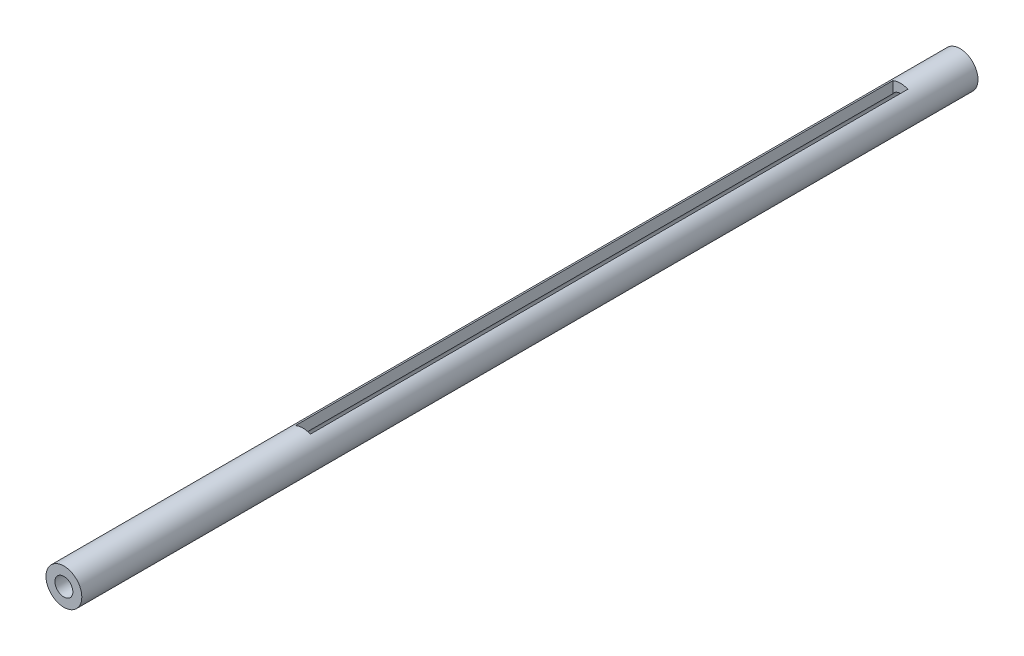
ISO-10303-21;
HEADER;
FILE_DESCRIPTION(('STEP AP214'),'2;1');
FILE_NAME('part.step','',(''),(''),'','','');
FILE_SCHEMA(('AUTOMOTIVE_DESIGN { 1 0 10303 214 1 1 1 1 }'));
ENDSEC;
DATA;
#1=APPLICATION_CONTEXT('core data for automotive mechanical design processes');
#2=APPLICATION_PROTOCOL_DEFINITION('international standard','automotive_design',2000,#1);
#3=PRODUCT_CONTEXT('',#1,'mechanical');
#4=PRODUCT('Part','Part','',(#3));
#5=PRODUCT_RELATED_PRODUCT_CATEGORY('part','',(#4));
#6=PRODUCT_DEFINITION_FORMATION('','',#4);
#7=PRODUCT_DEFINITION_CONTEXT('part definition',#1,'design');
#8=PRODUCT_DEFINITION('design','',#6,#7);
#9=PRODUCT_DEFINITION_SHAPE('','',#8);
#10=(LENGTH_UNIT() NAMED_UNIT(*) SI_UNIT(.MILLI.,.METRE.));
#11=(NAMED_UNIT(*) PLANE_ANGLE_UNIT() SI_UNIT($,.RADIAN.));
#12=(NAMED_UNIT(*) SI_UNIT($,.STERADIAN.) SOLID_ANGLE_UNIT());
#13=UNCERTAINTY_MEASURE_WITH_UNIT(LENGTH_MEASURE(1.E-05),#10,'distance_accuracy_value','');
#14=(GEOMETRIC_REPRESENTATION_CONTEXT(3) GLOBAL_UNCERTAINTY_ASSIGNED_CONTEXT((#13)) GLOBAL_UNIT_ASSIGNED_CONTEXT((#10,
#11,#12)) REPRESENTATION_CONTEXT('',''));
#15=CARTESIAN_POINT('',(0.,0.,0.));
#16=DIRECTION('',(0.,0.,1.));
#17=DIRECTION('',(1.,0.,0.));
#18=AXIS2_PLACEMENT_3D('',#15,#16,#17);
#19=CARTESIAN_POINT('',(0.,0.,150.));
#20=DIRECTION('',(0.,0.,1.));
#21=DIRECTION('',(1.,0.,0.));
#22=AXIS2_PLACEMENT_3D('',#19,#20,#21);
#23=PLANE('',#22);
#24=CARTESIAN_POINT('',(0.,0.,150.));
#25=DIRECTION('',(0.,0.,1.));
#26=DIRECTION('',(1.,0.,0.));
#27=AXIS2_PLACEMENT_3D('',#24,#25,#26);
#28=CIRCLE('',#27,3.);
#29=CARTESIAN_POINT('',(3.,0.,150.));
#30=VERTEX_POINT('',#29);
#31=EDGE_CURVE('E113',#30,#30,#28,.T.);
#32=ORIENTED_EDGE('',*,*,#31,.T.);
#33=EDGE_LOOP('',(#32));
#34=FACE_BOUND('',#33,.T.);
#35=CARTESIAN_POINT('',(0.,0.,150.));
#36=DIRECTION('',(0.,0.,1.));
#37=DIRECTION('',(1.,0.,0.));
#38=AXIS2_PLACEMENT_3D('',#35,#36,#37);
#39=CIRCLE('',#38,1.5);
#40=CARTESIAN_POINT('',(1.5,0.,150.));
#41=VERTEX_POINT('',#40);
#42=EDGE_CURVE('E104',#41,#41,#39,.T.);
#43=ORIENTED_EDGE('',*,*,#42,.F.);
#44=EDGE_LOOP('',(#43));
#45=FACE_BOUND('',#44,.T.);
#46=ADVANCED_FACE('F39',(#34,#45),#23,.T.);
#47=CARTESIAN_POINT('',(0.,0.,0.));
#48=DIRECTION('',(0.,0.,1.));
#49=DIRECTION('',(1.,0.,0.));
#50=AXIS2_PLACEMENT_3D('',#47,#48,#49);
#51=PLANE('',#50);
#52=CARTESIAN_POINT('',(0.,0.,0.));
#53=DIRECTION('',(0.,0.,1.));
#54=DIRECTION('',(1.,0.,0.));
#55=AXIS2_PLACEMENT_3D('',#52,#53,#54);
#56=CIRCLE('',#55,3.);
#57=CARTESIAN_POINT('',(3.,0.,0.));
#58=VERTEX_POINT('',#57);
#59=EDGE_CURVE('E111',#58,#58,#56,.T.);
#60=ORIENTED_EDGE('',*,*,#59,.F.);
#61=EDGE_LOOP('',(#60));
#62=FACE_BOUND('',#61,.T.);
#63=CARTESIAN_POINT('',(0.,0.,0.));
#64=DIRECTION('',(0.,0.,1.));
#65=DIRECTION('',(1.,0.,0.));
#66=AXIS2_PLACEMENT_3D('',#63,#64,#65);
#67=CIRCLE('',#66,1.5);
#68=CARTESIAN_POINT('',(1.5,0.,0.));
#69=VERTEX_POINT('',#68);
#70=EDGE_CURVE('E99',#69,#69,#67,.T.);
#71=ORIENTED_EDGE('',*,*,#70,.T.);
#72=EDGE_LOOP('',(#71));
#73=FACE_BOUND('',#72,.T.);
#74=ADVANCED_FACE('F154',(#62,#73),#51,.F.);
#75=CARTESIAN_POINT('',(0.,0.,150.));
#76=DIRECTION('',(0.,0.,-1.));
#77=DIRECTION('',(-1.,0.,0.));
#78=AXIS2_PLACEMENT_3D('',#75,#76,#77);
#79=CYLINDRICAL_SURFACE('',#78,3.);
#80=DIRECTION('',(0.,0.,-1.));
#81=VECTOR('',#80,1.);
#82=CARTESIAN_POINT('',(-1.25,2.72717802865893,150.));
#83=LINE('',#82,#81);
#84=CARTESIAN_POINT('',(-1.25,2.72717802865893,9.99999999999999));
#85=VERTEX_POINT('',#84);
#86=CARTESIAN_POINT('',(-1.25,2.72717802865893,110.));
#87=VERTEX_POINT('',#86);
#88=EDGE_CURVE('E97',#85,#87,#83,.F.);
#89=ORIENTED_EDGE('',*,*,#88,.F.);
#90=CARTESIAN_POINT('',(0.,0.,9.99999999999998));
#91=DIRECTION('',(0.,0.,-1.));
#92=DIRECTION('',(-1.,0.,0.));
#93=AXIS2_PLACEMENT_3D('',#90,#91,#92);
#94=CIRCLE('',#93,3.);
#95=CARTESIAN_POINT('',(1.25,2.72717802865893,9.99999999999999));
#96=VERTEX_POINT('',#95);
#97=EDGE_CURVE('E89',#85,#96,#94,.T.);
#98=ORIENTED_EDGE('',*,*,#97,.T.);
#99=DIRECTION('',(0.,0.,-1.));
#100=VECTOR('',#99,1.);
#101=CARTESIAN_POINT('',(1.25,2.72717802865893,150.));
#102=LINE('',#101,#100);
#103=CARTESIAN_POINT('',(1.25,2.72717802865893,110.));
#104=VERTEX_POINT('',#103);
#105=EDGE_CURVE('E77',#96,#104,#102,.F.);
#106=ORIENTED_EDGE('',*,*,#105,.T.);
#107=CARTESIAN_POINT('',(0.,0.,110.));
#108=DIRECTION('',(0.,0.,-1.));
#109=DIRECTION('',(-1.,0.,0.));
#110=AXIS2_PLACEMENT_3D('',#107,#108,#109);
#111=CIRCLE('',#110,3.);
#112=EDGE_CURVE('E83',#87,#104,#111,.T.);
#113=ORIENTED_EDGE('',*,*,#112,.F.);
#114=EDGE_LOOP('',(#89,#98,#106,#113));
#115=FACE_BOUND('',#114,.T.);
#116=ORIENTED_EDGE('',*,*,#31,.F.);
#117=EDGE_LOOP('',(#116));
#118=FACE_BOUND('',#117,.T.);
#119=ORIENTED_EDGE('',*,*,#59,.T.);
#120=EDGE_LOOP('',(#119));
#121=FACE_BOUND('',#120,.T.);
#122=ADVANCED_FACE('F41',(#115,#118,#121),#79,.T.);
#123=CARTESIAN_POINT('',(0.,0.,150.));
#124=DIRECTION('',(0.,0.,-1.));
#125=DIRECTION('',(-1.,0.,0.));
#126=AXIS2_PLACEMENT_3D('',#123,#124,#125);
#127=CYLINDRICAL_SURFACE('',#126,1.5);
#128=CARTESIAN_POINT('',(0.,0.,9.99999999999998));
#129=DIRECTION('',(0.,0.,-1.));
#130=DIRECTION('',(-1.,0.,0.));
#131=AXIS2_PLACEMENT_3D('',#128,#129,#130);
#132=CIRCLE('',#131,1.5);
#133=CARTESIAN_POINT('',(-1.25,0.829156197588846,9.99999999999999));
#134=VERTEX_POINT('',#133);
#135=CARTESIAN_POINT('',(1.25,0.82915619758885,10.));
#136=VERTEX_POINT('',#135);
#137=EDGE_CURVE('E11',#134,#136,#132,.T.);
#138=ORIENTED_EDGE('',*,*,#137,.F.);
#139=DIRECTION('',(0.,0.,-1.));
#140=VECTOR('',#139,1.);
#141=CARTESIAN_POINT('',(-1.25,0.82915619758885,150.));
#142=LINE('',#141,#140);
#143=CARTESIAN_POINT('',(-1.25,0.82915619758885,110.));
#144=VERTEX_POINT('',#143);
#145=EDGE_CURVE('E48',#134,#144,#142,.F.);
#146=ORIENTED_EDGE('',*,*,#145,.T.);
#147=CARTESIAN_POINT('',(0.,0.,110.));
#148=DIRECTION('',(0.,0.,-1.));
#149=DIRECTION('',(-1.,0.,0.));
#150=AXIS2_PLACEMENT_3D('',#147,#148,#149);
#151=CIRCLE('',#150,1.5);
#152=CARTESIAN_POINT('',(1.25,0.829156197588846,110.));
#153=VERTEX_POINT('',#152);
#154=EDGE_CURVE('E123',#144,#153,#151,.T.);
#155=ORIENTED_EDGE('',*,*,#154,.T.);
#156=DIRECTION('',(0.,0.,-1.));
#157=VECTOR('',#156,1.);
#158=CARTESIAN_POINT('',(1.25,0.82915619758885,150.));
#159=LINE('',#158,#157);
#160=EDGE_CURVE('E117',#136,#153,#159,.F.);
#161=ORIENTED_EDGE('',*,*,#160,.F.);
#162=EDGE_LOOP('',(#138,#146,#155,#161));
#163=FACE_BOUND('',#162,.T.);
#164=ORIENTED_EDGE('',*,*,#42,.T.);
#165=EDGE_LOOP('',(#164));
#166=FACE_BOUND('',#165,.T.);
#167=ORIENTED_EDGE('',*,*,#70,.F.);
#168=EDGE_LOOP('',(#167));
#169=FACE_BOUND('',#168,.T.);
#170=ADVANCED_FACE('F129',(#163,#166,#169),#127,.F.);
#171=CARTESIAN_POINT('',(0.,100.,9.99999999999999));
#172=DIRECTION('',(0.,0.,-1.));
#173=DIRECTION('',(-1.,0.,0.));
#174=AXIS2_PLACEMENT_3D('',#171,#172,#173);
#175=PLANE('',#174);
#176=DIRECTION('',(0.,-1.,0.));
#177=VECTOR('',#176,1.);
#178=CARTESIAN_POINT('',(-1.25,100.,9.99999999999999));
#179=LINE('',#178,#177);
#180=EDGE_CURVE('E84',#85,#134,#179,.T.);
#181=ORIENTED_EDGE('',*,*,#180,.T.);
#182=ORIENTED_EDGE('',*,*,#137,.T.);
#183=DIRECTION('',(0.,-1.,0.));
#184=VECTOR('',#183,1.);
#185=CARTESIAN_POINT('',(1.25,100.,9.99999999999999));
#186=LINE('',#185,#184);
#187=EDGE_CURVE('E60',#96,#136,#186,.T.);
#188=ORIENTED_EDGE('',*,*,#187,.F.);
#189=ORIENTED_EDGE('',*,*,#97,.F.);
#190=EDGE_LOOP('',(#181,#182,#188,#189));
#191=FACE_BOUND('',#190,.T.);
#192=ADVANCED_FACE('F88',(#191),#175,.F.);
#193=CARTESIAN_POINT('',(-1.25,100.,0.));
#194=DIRECTION('',(1.,0.,0.));
#195=DIRECTION('',(0.,0.,-1.));
#196=AXIS2_PLACEMENT_3D('',#193,#194,#195);
#197=PLANE('',#196);
#198=ORIENTED_EDGE('',*,*,#88,.T.);
#199=DIRECTION('',(0.,-1.,0.));
#200=VECTOR('',#199,1.);
#201=CARTESIAN_POINT('',(-1.25,100.,110.));
#202=LINE('',#201,#200);
#203=EDGE_CURVE('E135',#87,#144,#202,.T.);
#204=ORIENTED_EDGE('',*,*,#203,.T.);
#205=ORIENTED_EDGE('',*,*,#145,.F.);
#206=ORIENTED_EDGE('',*,*,#180,.F.);
#207=EDGE_LOOP('',(#198,#204,#205,#206));
#208=FACE_BOUND('',#207,.T.);
#209=ADVANCED_FACE('F133',(#208),#197,.T.);
#210=CARTESIAN_POINT('',(0.,100.,110.));
#211=DIRECTION('',(0.,0.,-1.));
#212=DIRECTION('',(-1.,0.,0.));
#213=AXIS2_PLACEMENT_3D('',#210,#211,#212);
#214=PLANE('',#213);
#215=ORIENTED_EDGE('',*,*,#112,.T.);
#216=DIRECTION('',(0.,-1.,0.));
#217=VECTOR('',#216,1.);
#218=CARTESIAN_POINT('',(1.25,100.,110.));
#219=LINE('',#218,#217);
#220=EDGE_CURVE('E55',#104,#153,#219,.T.);
#221=ORIENTED_EDGE('',*,*,#220,.T.);
#222=ORIENTED_EDGE('',*,*,#154,.F.);
#223=ORIENTED_EDGE('',*,*,#203,.F.);
#224=EDGE_LOOP('',(#215,#221,#222,#223));
#225=FACE_BOUND('',#224,.T.);
#226=ADVANCED_FACE('F143',(#225),#214,.T.);
#227=CARTESIAN_POINT('',(1.25,100.,0.));
#228=DIRECTION('',(1.,0.,0.));
#229=DIRECTION('',(0.,0.,-1.));
#230=AXIS2_PLACEMENT_3D('',#227,#228,#229);
#231=PLANE('',#230);
#232=ORIENTED_EDGE('',*,*,#187,.T.);
#233=ORIENTED_EDGE('',*,*,#160,.T.);
#234=ORIENTED_EDGE('',*,*,#220,.F.);
#235=ORIENTED_EDGE('',*,*,#105,.F.);
#236=EDGE_LOOP('',(#232,#233,#234,#235));
#237=FACE_BOUND('',#236,.T.);
#238=ADVANCED_FACE('F78',(#237),#231,.F.);
#239=CLOSED_SHELL('',(#46,#74,#122,#170,#192,#209,#226,#238));
#240=MANIFOLD_SOLID_BREP('B2',#239);
#241=ADVANCED_BREP_SHAPE_REPRESENTATION('',(#18,#240),#14);
#242=SHAPE_DEFINITION_REPRESENTATION(#9,#241);
ENDSEC;
END-ISO-10303-21;
